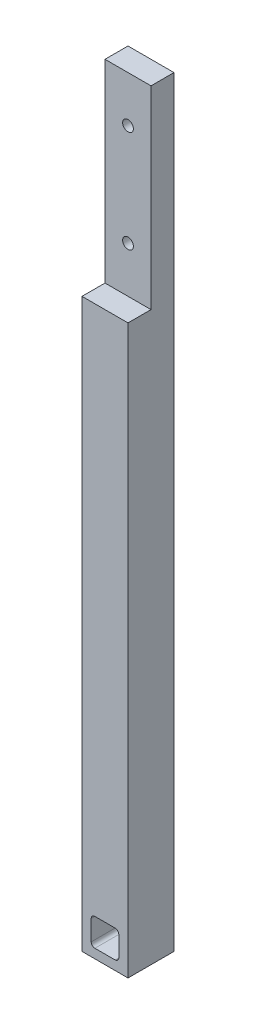
ISO-10303-21;
HEADER;
FILE_DESCRIPTION(('STEP AP214'),'2;1');
FILE_NAME('part.step','',(''),(''),'','','');
FILE_SCHEMA(('AUTOMOTIVE_DESIGN { 1 0 10303 214 1 1 1 1 }'));
ENDSEC;
DATA;
#1=APPLICATION_CONTEXT('core data for automotive mechanical design processes');
#2=APPLICATION_PROTOCOL_DEFINITION('international standard','automotive_design',2000,#1);
#3=PRODUCT_CONTEXT('',#1,'mechanical');
#4=PRODUCT('Part','Part','',(#3));
#5=PRODUCT_RELATED_PRODUCT_CATEGORY('part','',(#4));
#6=PRODUCT_DEFINITION_FORMATION('','',#4);
#7=PRODUCT_DEFINITION_CONTEXT('part definition',#1,'design');
#8=PRODUCT_DEFINITION('design','',#6,#7);
#9=PRODUCT_DEFINITION_SHAPE('','',#8);
#10=(LENGTH_UNIT() NAMED_UNIT(*) SI_UNIT(.MILLI.,.METRE.));
#11=(NAMED_UNIT(*) PLANE_ANGLE_UNIT() SI_UNIT($,.RADIAN.));
#12=(NAMED_UNIT(*) SI_UNIT($,.STERADIAN.) SOLID_ANGLE_UNIT());
#13=UNCERTAINTY_MEASURE_WITH_UNIT(LENGTH_MEASURE(1.E-05),#10,'distance_accuracy_value','');
#14=(GEOMETRIC_REPRESENTATION_CONTEXT(3) GLOBAL_UNCERTAINTY_ASSIGNED_CONTEXT((#13)) GLOBAL_UNIT_ASSIGNED_CONTEXT((#10,
#11,#12)) REPRESENTATION_CONTEXT('',''));
#15=CARTESIAN_POINT('',(0.,0.,0.));
#16=DIRECTION('',(0.,0.,1.));
#17=DIRECTION('',(1.,0.,0.));
#18=AXIS2_PLACEMENT_3D('',#15,#16,#17);
#19=CARTESIAN_POINT('',(-22.5,-95.0000000000001,42.3497474683057));
#20=DIRECTION('',(0.,0.,-1.));
#21=DIRECTION('',(-1.,0.,0.));
#22=AXIS2_PLACEMENT_3D('',#19,#20,#21);
#23=CYLINDRICAL_SURFACE('',#22,1.74999999999998);
#24=CARTESIAN_POINT('',(-22.5,-95.0000000000001,-99.9));
#25=DIRECTION('',(0.,0.,-1.));
#26=DIRECTION('',(-1.,0.,0.));
#27=AXIS2_PLACEMENT_3D('',#24,#25,#26);
#28=CIRCLE('',#27,1.74999999999998);
#29=CARTESIAN_POINT('',(-24.25,-95.0000000000001,-99.9));
#30=VERTEX_POINT('',#29);
#31=EDGE_CURVE('E278',#30,#30,#28,.T.);
#32=ORIENTED_EDGE('',*,*,#31,.F.);
#33=EDGE_LOOP('',(#32));
#34=FACE_BOUND('',#33,.T.);
#35=CARTESIAN_POINT('',(-22.5,-95.0000000000001,-104.4));
#36=DIRECTION('',(0.,0.,-1.));
#37=DIRECTION('',(-1.,0.,0.));
#38=AXIS2_PLACEMENT_3D('',#35,#36,#37);
#39=CIRCLE('',#38,1.74999999999998);
#40=CARTESIAN_POINT('',(-24.25,-95.0000000000001,-104.4));
#41=VERTEX_POINT('',#40);
#42=EDGE_CURVE('E43',#41,#41,#39,.F.);
#43=ORIENTED_EDGE('',*,*,#42,.F.);
#44=EDGE_LOOP('',(#43));
#45=FACE_BOUND('',#44,.T.);
#46=ADVANCED_FACE('F39',(#34,#45),#23,.F.);
#47=CARTESIAN_POINT('',(-22.5,-128.191488077077,42.3497474683057));
#48=DIRECTION('',(0.,0.,-1.));
#49=DIRECTION('',(-1.,0.,0.));
#50=AXIS2_PLACEMENT_3D('',#47,#48,#49);
#51=CYLINDRICAL_SURFACE('',#50,1.74999999999998);
#52=CARTESIAN_POINT('',(-22.5,-128.191488077077,-99.9));
#53=DIRECTION('',(0.,0.,-1.));
#54=DIRECTION('',(-1.,0.,0.));
#55=AXIS2_PLACEMENT_3D('',#52,#53,#54);
#56=CIRCLE('',#55,1.74999999999998);
#57=CARTESIAN_POINT('',(-24.25,-128.191488077077,-99.9));
#58=VERTEX_POINT('',#57);
#59=EDGE_CURVE('E157',#58,#58,#56,.T.);
#60=ORIENTED_EDGE('',*,*,#59,.F.);
#61=EDGE_LOOP('',(#60));
#62=FACE_BOUND('',#61,.T.);
#63=CARTESIAN_POINT('',(-22.5,-128.191488077077,-104.4));
#64=DIRECTION('',(0.,0.,-1.));
#65=DIRECTION('',(-1.,0.,0.));
#66=AXIS2_PLACEMENT_3D('',#63,#64,#65);
#67=CIRCLE('',#66,1.74999999999998);
#68=CARTESIAN_POINT('',(-24.25,-128.191488077077,-104.4));
#69=VERTEX_POINT('',#68);
#70=EDGE_CURVE('E268',#69,#69,#67,.F.);
#71=ORIENTED_EDGE('',*,*,#70,.F.);
#72=EDGE_LOOP('',(#71));
#73=FACE_BOUND('',#72,.T.);
#74=ADVANCED_FACE('F364',(#62,#73),#51,.F.);
#75=CARTESIAN_POINT('',(360.01,-143.191488077077,-99.9));
#76=DIRECTION('',(0.,-1.,0.));
#77=DIRECTION('',(0.,0.,-1.));
#78=AXIS2_PLACEMENT_3D('',#75,#76,#77);
#79=PLANE('',#78);
#80=DIRECTION('',(0.,0.,-1.));
#81=VECTOR('',#80,1.);
#82=CARTESIAN_POINT('',(-15.,-143.191488077077,-107.4));
#83=LINE('',#82,#81);
#84=CARTESIAN_POINT('',(-15.,-143.191488077077,-92.4));
#85=VERTEX_POINT('',#84);
#86=CARTESIAN_POINT('',(-15.,-143.191488077077,-99.9));
#87=VERTEX_POINT('',#86);
#88=EDGE_CURVE('E242',#85,#87,#83,.T.);
#89=ORIENTED_EDGE('',*,*,#88,.T.);
#90=DIRECTION('',(-1.,0.,0.));
#91=VECTOR('',#90,1.);
#92=CARTESIAN_POINT('',(360.01,-143.191488077077,-99.9));
#93=LINE('',#92,#91);
#94=CARTESIAN_POINT('',(-30.,-143.191488077077,-99.9));
#95=VERTEX_POINT('',#94);
#96=EDGE_CURVE('E12',#87,#95,#93,.T.);
#97=ORIENTED_EDGE('',*,*,#96,.T.);
#98=DIRECTION('',(0.,0.,1.));
#99=VECTOR('',#98,1.);
#100=CARTESIAN_POINT('',(-30.,-143.191488077077,-107.4));
#101=LINE('',#100,#99);
#102=CARTESIAN_POINT('',(-30.,-143.191488077077,-92.4));
#103=VERTEX_POINT('',#102);
#104=EDGE_CURVE('E253',#95,#103,#101,.T.);
#105=ORIENTED_EDGE('',*,*,#104,.T.);
#106=DIRECTION('',(1.,0.,0.));
#107=VECTOR('',#106,1.);
#108=CARTESIAN_POINT('',(-15.,-143.191488077077,-92.4));
#109=LINE('',#108,#107);
#110=EDGE_CURVE('E57',#103,#85,#109,.T.);
#111=ORIENTED_EDGE('',*,*,#110,.T.);
#112=EDGE_LOOP('',(#89,#97,#105,#111));
#113=FACE_BOUND('',#112,.T.);
#114=ADVANCED_FACE('F370',(#113),#79,.F.);
#115=CARTESIAN_POINT('',(360.01,-80.,-99.9));
#116=DIRECTION('',(0.,0.,-1.));
#117=DIRECTION('',(-1.,0.,0.));
#118=AXIS2_PLACEMENT_3D('',#115,#116,#117);
#119=PLANE('',#118);
#120=ORIENTED_EDGE('',*,*,#59,.T.);
#121=EDGE_LOOP('',(#120));
#122=FACE_BOUND('',#121,.T.);
#123=ORIENTED_EDGE('',*,*,#31,.T.);
#124=EDGE_LOOP('',(#123));
#125=FACE_BOUND('',#124,.T.);
#126=DIRECTION('',(0.,1.,0.));
#127=VECTOR('',#126,1.);
#128=CARTESIAN_POINT('',(-15.,-349.404691512674,-99.9));
#129=LINE('',#128,#127);
#130=CARTESIAN_POINT('',(-15.,-80.,-99.9));
#131=VERTEX_POINT('',#130);
#132=EDGE_CURVE('E245',#87,#131,#129,.T.);
#133=ORIENTED_EDGE('',*,*,#132,.T.);
#134=DIRECTION('',(-1.,0.,0.));
#135=VECTOR('',#134,1.);
#136=CARTESIAN_POINT('',(360.01,-80.,-99.9));
#137=LINE('',#136,#135);
#138=CARTESIAN_POINT('',(-30.,-80.,-99.9));
#139=VERTEX_POINT('',#138);
#140=EDGE_CURVE('E49',#131,#139,#137,.T.);
#141=ORIENTED_EDGE('',*,*,#140,.T.);
#142=DIRECTION('',(0.,-1.,0.));
#143=VECTOR('',#142,1.);
#144=CARTESIAN_POINT('',(-30.,-349.404691512674,-99.9));
#145=LINE('',#144,#143);
#146=EDGE_CURVE('E256',#139,#95,#145,.T.);
#147=ORIENTED_EDGE('',*,*,#146,.T.);
#148=ORIENTED_EDGE('',*,*,#96,.F.);
#149=EDGE_LOOP('',(#133,#141,#147,#148));
#150=FACE_BOUND('',#149,.T.);
#151=ADVANCED_FACE('F406',(#122,#125,#150),#119,.F.);
#152=CARTESIAN_POINT('',(360.01,-80.,-107.4));
#153=DIRECTION('',(0.,-1.,0.));
#154=DIRECTION('',(0.,0.,-1.));
#155=AXIS2_PLACEMENT_3D('',#152,#153,#154);
#156=PLANE('',#155);
#157=DIRECTION('',(0.,0.,-1.));
#158=VECTOR('',#157,1.);
#159=CARTESIAN_POINT('',(-15.,-80.,-107.4));
#160=LINE('',#159,#158);
#161=CARTESIAN_POINT('',(-15.,-80.0000000000001,-107.4));
#162=VERTEX_POINT('',#161);
#163=EDGE_CURVE('E248',#131,#162,#160,.T.);
#164=ORIENTED_EDGE('',*,*,#163,.T.);
#165=DIRECTION('',(-1.,0.,0.));
#166=VECTOR('',#165,1.);
#167=CARTESIAN_POINT('',(-15.,-80.,-107.4));
#168=LINE('',#167,#166);
#169=CARTESIAN_POINT('',(-30.,-80.0000000000001,-107.4));
#170=VERTEX_POINT('',#169);
#171=EDGE_CURVE('E65',#162,#170,#168,.T.);
#172=ORIENTED_EDGE('',*,*,#171,.T.);
#173=DIRECTION('',(0.,0.,1.));
#174=VECTOR('',#173,1.);
#175=CARTESIAN_POINT('',(-30.,-80.,-107.4));
#176=LINE('',#175,#174);
#177=EDGE_CURVE('E260',#170,#139,#176,.T.);
#178=ORIENTED_EDGE('',*,*,#177,.T.);
#179=ORIENTED_EDGE('',*,*,#140,.F.);
#180=EDGE_LOOP('',(#164,#172,#178,#179));
#181=FACE_BOUND('',#180,.T.);
#182=ADVANCED_FACE('F41',(#181),#156,.F.);
#183=CARTESIAN_POINT('',(-245.605810854801,-328.191488077077,7.39999999999999));
#184=DIRECTION('',(0.,-1.,0.));
#185=DIRECTION('',(0.,0.,-1.));
#186=AXIS2_PLACEMENT_3D('',#183,#184,#185);
#187=PLANE('',#186);
#188=DIRECTION('',(0.,0.,-1.));
#189=VECTOR('',#188,1.);
#190=CARTESIAN_POINT('',(-15.,-328.191488077077,-107.4));
#191=LINE('',#190,#189);
#192=CARTESIAN_POINT('',(-15.,-328.191488077077,-92.4));
#193=VERTEX_POINT('',#192);
#194=CARTESIAN_POINT('',(-15.,-328.191488077077,-107.4));
#195=VERTEX_POINT('',#194);
#196=EDGE_CURVE('E216',#193,#195,#191,.T.);
#197=ORIENTED_EDGE('',*,*,#196,.F.);
#198=DIRECTION('',(1.,0.,0.));
#199=VECTOR('',#198,1.);
#200=CARTESIAN_POINT('',(-15.,-328.191488077077,-92.4));
#201=LINE('',#200,#199);
#202=CARTESIAN_POINT('',(-30.,-328.191488077077,-92.4));
#203=VERTEX_POINT('',#202);
#204=EDGE_CURVE('E222',#203,#193,#201,.T.);
#205=ORIENTED_EDGE('',*,*,#204,.F.);
#206=DIRECTION('',(0.,0.,1.));
#207=VECTOR('',#206,1.);
#208=CARTESIAN_POINT('',(-30.,-328.191488077077,-107.4));
#209=LINE('',#208,#207);
#210=CARTESIAN_POINT('',(-30.,-328.191488077077,-107.4));
#211=VERTEX_POINT('',#210);
#212=EDGE_CURVE('E227',#211,#203,#209,.T.);
#213=ORIENTED_EDGE('',*,*,#212,.F.);
#214=DIRECTION('',(-1.,0.,0.));
#215=VECTOR('',#214,1.);
#216=CARTESIAN_POINT('',(-15.,-328.191488077077,-107.4));
#217=LINE('',#216,#215);
#218=EDGE_CURVE('E174',#195,#211,#217,.T.);
#219=ORIENTED_EDGE('',*,*,#218,.F.);
#220=EDGE_LOOP('',(#197,#205,#213,#219));
#221=FACE_BOUND('',#220,.T.);
#222=ADVANCED_FACE('F400',(#221),#187,.T.);
#223=CARTESIAN_POINT('',(-15.,-349.404691512674,-107.4));
#224=DIRECTION('',(0.,0.,-1.));
#225=DIRECTION('',(-1.,0.,0.));
#226=AXIS2_PLACEMENT_3D('',#223,#224,#225);
#227=PLANE('',#226);
#228=CARTESIAN_POINT('',(-22.5,-95.0000000000001,-107.4));
#229=DIRECTION('',(0.,0.,-1.));
#230=DIRECTION('',(-1.,0.,0.));
#231=AXIS2_PLACEMENT_3D('',#228,#229,#230);
#232=CIRCLE('',#231,3.);
#233=CARTESIAN_POINT('',(-25.5,-95.0000000000001,-107.4));
#234=VERTEX_POINT('',#233);
#235=EDGE_CURVE('E271',#234,#234,#232,.T.);
#236=ORIENTED_EDGE('',*,*,#235,.F.);
#237=EDGE_LOOP('',(#236));
#238=FACE_BOUND('',#237,.T.);
#239=CARTESIAN_POINT('',(-22.5,-128.191488077077,-107.4));
#240=DIRECTION('',(0.,0.,-1.));
#241=DIRECTION('',(-1.,0.,0.));
#242=AXIS2_PLACEMENT_3D('',#239,#240,#241);
#243=CIRCLE('',#242,3.);
#244=CARTESIAN_POINT('',(-25.5,-128.191488077077,-107.4));
#245=VERTEX_POINT('',#244);
#246=EDGE_CURVE('E287',#245,#245,#243,.T.);
#247=ORIENTED_EDGE('',*,*,#246,.F.);
#248=EDGE_LOOP('',(#247));
#249=FACE_BOUND('',#248,.T.);
#250=ORIENTED_EDGE('',*,*,#171,.F.);
#251=DIRECTION('',(0.,1.,0.));
#252=VECTOR('',#251,1.);
#253=CARTESIAN_POINT('',(-15.,-349.404691512674,-107.4));
#254=LINE('',#253,#252);
#255=EDGE_CURVE('E220',#195,#162,#254,.T.);
#256=ORIENTED_EDGE('',*,*,#255,.F.);
#257=ORIENTED_EDGE('',*,*,#218,.T.);
#258=DIRECTION('',(0.,1.,0.));
#259=VECTOR('',#258,1.);
#260=CARTESIAN_POINT('',(-30.,-349.404691512674,-107.4));
#261=LINE('',#260,#259);
#262=EDGE_CURVE('E180',#211,#170,#261,.T.);
#263=ORIENTED_EDGE('',*,*,#262,.T.);
#264=EDGE_LOOP('',(#250,#256,#257,#263));
#265=FACE_BOUND('',#264,.T.);
#266=ADVANCED_FACE('F396',(#238,#249,#265),#227,.T.);
#267=CARTESIAN_POINT('',(-30.,-349.404691512674,-107.4));
#268=DIRECTION('',(-1.,0.,0.));
#269=DIRECTION('',(0.,0.,1.));
#270=AXIS2_PLACEMENT_3D('',#267,#268,#269);
#271=PLANE('',#270);
#272=ORIENTED_EDGE('',*,*,#177,.F.);
#273=ORIENTED_EDGE('',*,*,#262,.F.);
#274=ORIENTED_EDGE('',*,*,#212,.T.);
#275=DIRECTION('',(0.,1.,0.));
#276=VECTOR('',#275,1.);
#277=CARTESIAN_POINT('',(-30.,-349.404691512674,-92.4));
#278=LINE('',#277,#276);
#279=EDGE_CURVE('E226',#203,#103,#278,.T.);
#280=ORIENTED_EDGE('',*,*,#279,.T.);
#281=ORIENTED_EDGE('',*,*,#104,.F.);
#282=ORIENTED_EDGE('',*,*,#146,.F.);
#283=EDGE_LOOP('',(#272,#273,#274,#280,#281,#282));
#284=FACE_BOUND('',#283,.T.);
#285=ADVANCED_FACE('F389',(#284),#271,.T.);
#286=CARTESIAN_POINT('',(-15.,-349.404691512674,-92.4));
#287=DIRECTION('',(0.,0.,1.));
#288=DIRECTION('',(1.,0.,0.));
#289=AXIS2_PLACEMENT_3D('',#286,#287,#288);
#290=PLANE('',#289);
#291=ORIENTED_EDGE('',*,*,#110,.F.);
#292=ORIENTED_EDGE('',*,*,#279,.F.);
#293=ORIENTED_EDGE('',*,*,#204,.T.);
#294=DIRECTION('',(0.,1.,0.));
#295=VECTOR('',#294,1.);
#296=CARTESIAN_POINT('',(-15.,-349.404691512674,-92.4));
#297=LINE('',#296,#295);
#298=EDGE_CURVE('E221',#193,#85,#297,.T.);
#299=ORIENTED_EDGE('',*,*,#298,.T.);
#300=EDGE_LOOP('',(#291,#292,#293,#299));
#301=FACE_BOUND('',#300,.T.);
#302=CARTESIAN_POINT('',(-19.2,-323.991488077077,-92.4));
#303=DIRECTION('',(0.,0.,1.));
#304=DIRECTION('',(1.,0.,0.));
#305=AXIS2_PLACEMENT_3D('',#302,#303,#304);
#306=CIRCLE('',#305,1.19999999999999);
#307=CARTESIAN_POINT('',(-19.2,-325.191488077077,-92.4));
#308=VERTEX_POINT('',#307);
#309=CARTESIAN_POINT('',(-18.,-323.991488077077,-92.4));
#310=VERTEX_POINT('',#309);
#311=EDGE_CURVE('E148',#308,#310,#306,.T.);
#312=ORIENTED_EDGE('',*,*,#311,.F.);
#313=DIRECTION('',(1.,0.,0.));
#314=VECTOR('',#313,1.);
#315=CARTESIAN_POINT('',(-25.8,-325.191488077077,-92.4));
#316=LINE('',#315,#314);
#317=CARTESIAN_POINT('',(-25.8,-325.191488077077,-92.4));
#318=VERTEX_POINT('',#317);
#319=EDGE_CURVE('E160',#318,#308,#316,.T.);
#320=ORIENTED_EDGE('',*,*,#319,.F.);
#321=CARTESIAN_POINT('',(-25.8,-323.991488077077,-92.4));
#322=DIRECTION('',(0.,0.,1.));
#323=DIRECTION('',(1.,0.,0.));
#324=AXIS2_PLACEMENT_3D('',#321,#322,#323);
#325=CIRCLE('',#324,1.19999999999999);
#326=CARTESIAN_POINT('',(-27.,-323.991488077077,-92.4));
#327=VERTEX_POINT('',#326);
#328=EDGE_CURVE('E166',#327,#318,#325,.T.);
#329=ORIENTED_EDGE('',*,*,#328,.F.);
#330=DIRECTION('',(0.,-1.,0.));
#331=VECTOR('',#330,1.);
#332=CARTESIAN_POINT('',(-27.,-317.391488077077,-92.4));
#333=LINE('',#332,#331);
#334=CARTESIAN_POINT('',(-27.,-317.391488077077,-92.4));
#335=VERTEX_POINT('',#334);
#336=EDGE_CURVE('E324',#335,#327,#333,.T.);
#337=ORIENTED_EDGE('',*,*,#336,.F.);
#338=CARTESIAN_POINT('',(-25.8,-317.391488077077,-92.4));
#339=DIRECTION('',(0.,0.,1.));
#340=DIRECTION('',(1.,0.,0.));
#341=AXIS2_PLACEMENT_3D('',#338,#339,#340);
#342=CIRCLE('',#341,1.19999999999999);
#343=CARTESIAN_POINT('',(-25.8,-316.191488077077,-92.4));
#344=VERTEX_POINT('',#343);
#345=EDGE_CURVE('E328',#344,#335,#342,.T.);
#346=ORIENTED_EDGE('',*,*,#345,.F.);
#347=DIRECTION('',(-1.,0.,0.));
#348=VECTOR('',#347,1.);
#349=CARTESIAN_POINT('',(-19.2,-316.191488077077,-92.4));
#350=LINE('',#349,#348);
#351=CARTESIAN_POINT('',(-19.2,-316.191488077077,-92.4));
#352=VERTEX_POINT('',#351);
#353=EDGE_CURVE('E332',#352,#344,#350,.T.);
#354=ORIENTED_EDGE('',*,*,#353,.F.);
#355=CARTESIAN_POINT('',(-19.2,-317.391488077077,-92.4));
#356=DIRECTION('',(0.,0.,1.));
#357=DIRECTION('',(1.,0.,0.));
#358=AXIS2_PLACEMENT_3D('',#355,#356,#357);
#359=CIRCLE('',#358,1.19999999999999);
#360=CARTESIAN_POINT('',(-18.,-317.391488077077,-92.4));
#361=VERTEX_POINT('',#360);
#362=EDGE_CURVE('E182',#361,#352,#359,.T.);
#363=ORIENTED_EDGE('',*,*,#362,.F.);
#364=DIRECTION('',(0.,1.,0.));
#365=VECTOR('',#364,1.);
#366=CARTESIAN_POINT('',(-18.,-323.991488077077,-92.4));
#367=LINE('',#366,#365);
#368=EDGE_CURVE('E172',#310,#361,#367,.T.);
#369=ORIENTED_EDGE('',*,*,#368,.F.);
#370=EDGE_LOOP('',(#312,#320,#329,#337,#346,#354,#363,#369));
#371=FACE_BOUND('',#370,.T.);
#372=ADVANCED_FACE('F169',(#301,#371),#290,.T.);
#373=CARTESIAN_POINT('',(-15.,-349.404691512674,-107.4));
#374=DIRECTION('',(1.,0.,0.));
#375=DIRECTION('',(0.,0.,-1.));
#376=AXIS2_PLACEMENT_3D('',#373,#374,#375);
#377=PLANE('',#376);
#378=ORIENTED_EDGE('',*,*,#163,.F.);
#379=ORIENTED_EDGE('',*,*,#132,.F.);
#380=ORIENTED_EDGE('',*,*,#88,.F.);
#381=ORIENTED_EDGE('',*,*,#298,.F.);
#382=ORIENTED_EDGE('',*,*,#196,.T.);
#383=ORIENTED_EDGE('',*,*,#255,.T.);
#384=EDGE_LOOP('',(#378,#379,#380,#381,#382,#383));
#385=FACE_BOUND('',#384,.T.);
#386=ADVANCED_FACE('F377',(#385),#377,.T.);
#387=CARTESIAN_POINT('',(-19.2,-323.991488077077,-102.4));
#388=DIRECTION('',(0.,0.,1.));
#389=DIRECTION('',(1.,0.,0.));
#390=AXIS2_PLACEMENT_3D('',#387,#388,#389);
#391=CYLINDRICAL_SURFACE('',#390,1.19999999999999);
#392=ORIENTED_EDGE('',*,*,#311,.T.);
#393=DIRECTION('',(0.,0.,1.));
#394=VECTOR('',#393,1.);
#395=CARTESIAN_POINT('',(-18.,-323.991488077077,-102.4));
#396=LINE('',#395,#394);
#397=CARTESIAN_POINT('',(-18.,-323.991488077077,-102.4));
#398=VERTEX_POINT('',#397);
#399=EDGE_CURVE('E190',#398,#310,#396,.T.);
#400=ORIENTED_EDGE('',*,*,#399,.F.);
#401=CARTESIAN_POINT('',(-19.2,-323.991488077077,-102.4));
#402=DIRECTION('',(0.,0.,1.));
#403=DIRECTION('',(1.,0.,0.));
#404=AXIS2_PLACEMENT_3D('',#401,#402,#403);
#405=CIRCLE('',#404,1.19999999999999);
#406=CARTESIAN_POINT('',(-19.2,-325.191488077077,-102.4));
#407=VERTEX_POINT('',#406);
#408=EDGE_CURVE('E151',#407,#398,#405,.T.);
#409=ORIENTED_EDGE('',*,*,#408,.F.);
#410=DIRECTION('',(0.,0.,1.));
#411=VECTOR('',#410,1.);
#412=CARTESIAN_POINT('',(-19.2,-325.191488077077,-102.4));
#413=LINE('',#412,#411);
#414=EDGE_CURVE('E144',#407,#308,#413,.T.);
#415=ORIENTED_EDGE('',*,*,#414,.T.);
#416=EDGE_LOOP('',(#392,#400,#409,#415));
#417=FACE_BOUND('',#416,.T.);
#418=ADVANCED_FACE('F146',(#417),#391,.F.);
#419=CARTESIAN_POINT('',(-25.8,-325.191488077077,-102.4));
#420=DIRECTION('',(0.,-1.,0.));
#421=DIRECTION('',(0.,0.,-1.));
#422=AXIS2_PLACEMENT_3D('',#419,#420,#421);
#423=PLANE('',#422);
#424=ORIENTED_EDGE('',*,*,#319,.T.);
#425=ORIENTED_EDGE('',*,*,#414,.F.);
#426=DIRECTION('',(1.,0.,0.));
#427=VECTOR('',#426,1.);
#428=CARTESIAN_POINT('',(-25.8,-325.191488077077,-102.4));
#429=LINE('',#428,#427);
#430=CARTESIAN_POINT('',(-25.8,-325.191488077077,-102.4));
#431=VERTEX_POINT('',#430);
#432=EDGE_CURVE('E186',#431,#407,#429,.T.);
#433=ORIENTED_EDGE('',*,*,#432,.F.);
#434=DIRECTION('',(0.,0.,1.));
#435=VECTOR('',#434,1.);
#436=CARTESIAN_POINT('',(-25.8,-325.191488077077,-102.4));
#437=LINE('',#436,#435);
#438=EDGE_CURVE('E156',#431,#318,#437,.T.);
#439=ORIENTED_EDGE('',*,*,#438,.T.);
#440=EDGE_LOOP('',(#424,#425,#433,#439));
#441=FACE_BOUND('',#440,.T.);
#442=ADVANCED_FACE('F161',(#441),#423,.F.);
#443=CARTESIAN_POINT('',(-25.8,-323.991488077077,-102.4));
#444=DIRECTION('',(0.,0.,1.));
#445=DIRECTION('',(1.,0.,0.));
#446=AXIS2_PLACEMENT_3D('',#443,#444,#445);
#447=CYLINDRICAL_SURFACE('',#446,1.19999999999999);
#448=ORIENTED_EDGE('',*,*,#328,.T.);
#449=ORIENTED_EDGE('',*,*,#438,.F.);
#450=CARTESIAN_POINT('',(-25.8,-323.991488077077,-102.4));
#451=DIRECTION('',(0.,0.,1.));
#452=DIRECTION('',(1.,0.,0.));
#453=AXIS2_PLACEMENT_3D('',#450,#451,#452);
#454=CIRCLE('',#453,1.19999999999999);
#455=CARTESIAN_POINT('',(-27.,-323.991488077077,-102.4));
#456=VERTEX_POINT('',#455);
#457=EDGE_CURVE('E189',#456,#431,#454,.T.);
#458=ORIENTED_EDGE('',*,*,#457,.F.);
#459=DIRECTION('',(0.,0.,1.));
#460=VECTOR('',#459,1.);
#461=CARTESIAN_POINT('',(-27.,-323.991488077077,-102.4));
#462=LINE('',#461,#460);
#463=EDGE_CURVE('E317',#456,#327,#462,.T.);
#464=ORIENTED_EDGE('',*,*,#463,.T.);
#465=EDGE_LOOP('',(#448,#449,#458,#464));
#466=FACE_BOUND('',#465,.T.);
#467=ADVANCED_FACE('F382',(#466),#447,.F.);
#468=CARTESIAN_POINT('',(-27.,-317.391488077077,-102.4));
#469=DIRECTION('',(-1.,0.,0.));
#470=DIRECTION('',(0.,0.,1.));
#471=AXIS2_PLACEMENT_3D('',#468,#469,#470);
#472=PLANE('',#471);
#473=ORIENTED_EDGE('',*,*,#336,.T.);
#474=ORIENTED_EDGE('',*,*,#463,.F.);
#475=DIRECTION('',(0.,-1.,0.));
#476=VECTOR('',#475,1.);
#477=CARTESIAN_POINT('',(-27.,-317.391488077077,-102.4));
#478=LINE('',#477,#476);
#479=CARTESIAN_POINT('',(-27.,-317.391488077077,-102.4));
#480=VERTEX_POINT('',#479);
#481=EDGE_CURVE('E194',#480,#456,#478,.T.);
#482=ORIENTED_EDGE('',*,*,#481,.F.);
#483=DIRECTION('',(0.,0.,1.));
#484=VECTOR('',#483,1.);
#485=CARTESIAN_POINT('',(-27.,-317.391488077077,-102.4));
#486=LINE('',#485,#484);
#487=EDGE_CURVE('E314',#480,#335,#486,.T.);
#488=ORIENTED_EDGE('',*,*,#487,.T.);
#489=EDGE_LOOP('',(#473,#474,#482,#488));
#490=FACE_BOUND('',#489,.T.);
#491=ADVANCED_FACE('F474',(#490),#472,.F.);
#492=CARTESIAN_POINT('',(-25.8,-317.391488077077,-102.4));
#493=DIRECTION('',(0.,0.,1.));
#494=DIRECTION('',(1.,0.,0.));
#495=AXIS2_PLACEMENT_3D('',#492,#493,#494);
#496=CYLINDRICAL_SURFACE('',#495,1.19999999999999);
#497=ORIENTED_EDGE('',*,*,#345,.T.);
#498=ORIENTED_EDGE('',*,*,#487,.F.);
#499=CARTESIAN_POINT('',(-25.8,-317.391488077077,-102.4));
#500=DIRECTION('',(0.,0.,1.));
#501=DIRECTION('',(1.,0.,0.));
#502=AXIS2_PLACEMENT_3D('',#499,#500,#501);
#503=CIRCLE('',#502,1.19999999999999);
#504=CARTESIAN_POINT('',(-25.8,-316.191488077077,-102.4));
#505=VERTEX_POINT('',#504);
#506=EDGE_CURVE('E198',#505,#480,#503,.T.);
#507=ORIENTED_EDGE('',*,*,#506,.F.);
#508=DIRECTION('',(0.,0.,1.));
#509=VECTOR('',#508,1.);
#510=CARTESIAN_POINT('',(-25.8,-316.191488077077,-102.4));
#511=LINE('',#510,#509);
#512=EDGE_CURVE('E311',#505,#344,#511,.T.);
#513=ORIENTED_EDGE('',*,*,#512,.T.);
#514=EDGE_LOOP('',(#497,#498,#507,#513));
#515=FACE_BOUND('',#514,.T.);
#516=ADVANCED_FACE('F486',(#515),#496,.F.);
#517=CARTESIAN_POINT('',(-19.2,-316.191488077077,-102.4));
#518=DIRECTION('',(0.,1.,0.));
#519=DIRECTION('',(0.,0.,1.));
#520=AXIS2_PLACEMENT_3D('',#517,#518,#519);
#521=PLANE('',#520);
#522=ORIENTED_EDGE('',*,*,#353,.T.);
#523=ORIENTED_EDGE('',*,*,#512,.F.);
#524=DIRECTION('',(-1.,0.,0.));
#525=VECTOR('',#524,1.);
#526=CARTESIAN_POINT('',(-19.2,-316.191488077077,-102.4));
#527=LINE('',#526,#525);
#528=CARTESIAN_POINT('',(-19.2,-316.191488077077,-102.4));
#529=VERTEX_POINT('',#528);
#530=EDGE_CURVE('E202',#529,#505,#527,.T.);
#531=ORIENTED_EDGE('',*,*,#530,.F.);
#532=DIRECTION('',(0.,0.,1.));
#533=VECTOR('',#532,1.);
#534=CARTESIAN_POINT('',(-19.2,-316.191488077077,-102.4));
#535=LINE('',#534,#533);
#536=EDGE_CURVE('E308',#529,#352,#535,.T.);
#537=ORIENTED_EDGE('',*,*,#536,.T.);
#538=EDGE_LOOP('',(#522,#523,#531,#537));
#539=FACE_BOUND('',#538,.T.);
#540=ADVANCED_FACE('F346',(#539),#521,.F.);
#541=CARTESIAN_POINT('',(-19.2,-317.391488077077,-102.4));
#542=DIRECTION('',(0.,0.,1.));
#543=DIRECTION('',(1.,0.,0.));
#544=AXIS2_PLACEMENT_3D('',#541,#542,#543);
#545=CYLINDRICAL_SURFACE('',#544,1.19999999999999);
#546=ORIENTED_EDGE('',*,*,#362,.T.);
#547=ORIENTED_EDGE('',*,*,#536,.F.);
#548=CARTESIAN_POINT('',(-19.2,-317.391488077077,-102.4));
#549=DIRECTION('',(0.,0.,1.));
#550=DIRECTION('',(1.,0.,0.));
#551=AXIS2_PLACEMENT_3D('',#548,#549,#550);
#552=CIRCLE('',#551,1.19999999999999);
#553=CARTESIAN_POINT('',(-18.,-317.391488077077,-102.4));
#554=VERTEX_POINT('',#553);
#555=EDGE_CURVE('E206',#554,#529,#552,.T.);
#556=ORIENTED_EDGE('',*,*,#555,.F.);
#557=DIRECTION('',(0.,0.,1.));
#558=VECTOR('',#557,1.);
#559=CARTESIAN_POINT('',(-18.,-317.391488077077,-102.4));
#560=LINE('',#559,#558);
#561=EDGE_CURVE('E305',#554,#361,#560,.T.);
#562=ORIENTED_EDGE('',*,*,#561,.T.);
#563=EDGE_LOOP('',(#546,#547,#556,#562));
#564=FACE_BOUND('',#563,.T.);
#565=ADVANCED_FACE('F340',(#564),#545,.F.);
#566=CARTESIAN_POINT('',(-18.,-323.991488077077,-102.4));
#567=DIRECTION('',(1.,0.,0.));
#568=DIRECTION('',(0.,0.,-1.));
#569=AXIS2_PLACEMENT_3D('',#566,#567,#568);
#570=PLANE('',#569);
#571=ORIENTED_EDGE('',*,*,#368,.T.);
#572=ORIENTED_EDGE('',*,*,#561,.F.);
#573=DIRECTION('',(0.,1.,0.));
#574=VECTOR('',#573,1.);
#575=CARTESIAN_POINT('',(-18.,-323.991488077077,-102.4));
#576=LINE('',#575,#574);
#577=EDGE_CURVE('E210',#398,#554,#576,.T.);
#578=ORIENTED_EDGE('',*,*,#577,.F.);
#579=ORIENTED_EDGE('',*,*,#399,.T.);
#580=EDGE_LOOP('',(#571,#572,#578,#579));
#581=FACE_BOUND('',#580,.T.);
#582=ADVANCED_FACE('F352',(#581),#570,.F.);
#583=CARTESIAN_POINT('',(-19.2,-323.991488077077,-102.4));
#584=DIRECTION('',(0.,0.,1.));
#585=DIRECTION('',(1.,0.,0.));
#586=AXIS2_PLACEMENT_3D('',#583,#584,#585);
#587=PLANE('',#586);
#588=ORIENTED_EDGE('',*,*,#408,.T.);
#589=ORIENTED_EDGE('',*,*,#577,.T.);
#590=ORIENTED_EDGE('',*,*,#555,.T.);
#591=ORIENTED_EDGE('',*,*,#530,.T.);
#592=ORIENTED_EDGE('',*,*,#506,.T.);
#593=ORIENTED_EDGE('',*,*,#481,.T.);
#594=ORIENTED_EDGE('',*,*,#457,.T.);
#595=ORIENTED_EDGE('',*,*,#432,.T.);
#596=EDGE_LOOP('',(#588,#589,#590,#591,#592,#593,#594,#595));
#597=FACE_BOUND('',#596,.T.);
#598=ADVANCED_FACE('F349',(#597),#587,.T.);
#599=CARTESIAN_POINT('',(-22.5,-128.191488077077,-104.4));
#600=DIRECTION('',(0.,0.,-1.));
#601=DIRECTION('',(-1.,0.,0.));
#602=AXIS2_PLACEMENT_3D('',#599,#600,#601);
#603=PLANE('',#602);
#604=CARTESIAN_POINT('',(-22.5,-128.191488077077,-104.4));
#605=DIRECTION('',(0.,0.,-1.));
#606=DIRECTION('',(-1.,0.,0.));
#607=AXIS2_PLACEMENT_3D('',#604,#605,#606);
#608=CIRCLE('',#607,3.);
#609=CARTESIAN_POINT('',(-25.5,-128.191488077077,-104.4));
#610=VERTEX_POINT('',#609);
#611=EDGE_CURVE('E293',#610,#610,#608,.T.);
#612=ORIENTED_EDGE('',*,*,#611,.T.);
#613=EDGE_LOOP('',(#612));
#614=FACE_BOUND('',#613,.T.);
#615=ORIENTED_EDGE('',*,*,#70,.T.);
#616=EDGE_LOOP('',(#615));
#617=FACE_BOUND('',#616,.T.);
#618=ADVANCED_FACE('F359',(#614,#617),#603,.T.);
#619=CARTESIAN_POINT('',(-22.5,-128.191488077077,-104.4));
#620=DIRECTION('',(0.,0.,-1.));
#621=DIRECTION('',(-1.,0.,0.));
#622=AXIS2_PLACEMENT_3D('',#619,#620,#621);
#623=CYLINDRICAL_SURFACE('',#622,3.);
#624=ORIENTED_EDGE('',*,*,#611,.F.);
#625=EDGE_LOOP('',(#624));
#626=FACE_BOUND('',#625,.T.);
#627=ORIENTED_EDGE('',*,*,#246,.T.);
#628=EDGE_LOOP('',(#627));
#629=FACE_BOUND('',#628,.T.);
#630=ADVANCED_FACE('F537',(#626,#629),#623,.F.);
#631=CARTESIAN_POINT('',(-22.5,-95.0000000000001,-104.4));
#632=DIRECTION('',(0.,0.,-1.));
#633=DIRECTION('',(-1.,0.,0.));
#634=AXIS2_PLACEMENT_3D('',#631,#632,#633);
#635=PLANE('',#634);
#636=CARTESIAN_POINT('',(-22.5,-95.0000000000001,-104.4));
#637=DIRECTION('',(0.,0.,-1.));
#638=DIRECTION('',(-1.,0.,0.));
#639=AXIS2_PLACEMENT_3D('',#636,#637,#638);
#640=CIRCLE('',#639,3.);
#641=CARTESIAN_POINT('',(-25.5,-95.0000000000001,-104.4));
#642=VERTEX_POINT('',#641);
#643=EDGE_CURVE('E280',#642,#642,#640,.T.);
#644=ORIENTED_EDGE('',*,*,#643,.T.);
#645=EDGE_LOOP('',(#644));
#646=FACE_BOUND('',#645,.T.);
#647=ORIENTED_EDGE('',*,*,#42,.T.);
#648=EDGE_LOOP('',(#647));
#649=FACE_BOUND('',#648,.T.);
#650=ADVANCED_FACE('F547',(#646,#649),#635,.T.);
#651=CARTESIAN_POINT('',(-22.5,-95.0000000000001,-104.4));
#652=DIRECTION('',(0.,0.,-1.));
#653=DIRECTION('',(-1.,0.,0.));
#654=AXIS2_PLACEMENT_3D('',#651,#652,#653);
#655=CYLINDRICAL_SURFACE('',#654,3.);
#656=ORIENTED_EDGE('',*,*,#643,.F.);
#657=EDGE_LOOP('',(#656));
#658=FACE_BOUND('',#657,.T.);
#659=ORIENTED_EDGE('',*,*,#235,.T.);
#660=EDGE_LOOP('',(#659));
#661=FACE_BOUND('',#660,.T.);
#662=ADVANCED_FACE('F558',(#658,#661),#655,.F.);
#663=CLOSED_SHELL('',(#46,#74,#114,#151,#182,#222,#266,#285,#372,#386,#418,#442,#467,#491,#516,
#540,#565,#582,#598,#618,#630,#650,#662));
#664=MANIFOLD_SOLID_BREP('B2',#663);
#665=ADVANCED_BREP_SHAPE_REPRESENTATION('',(#18,#664),#14);
#666=SHAPE_DEFINITION_REPRESENTATION(#9,#665);
ENDSEC;
END-ISO-10303-21;
